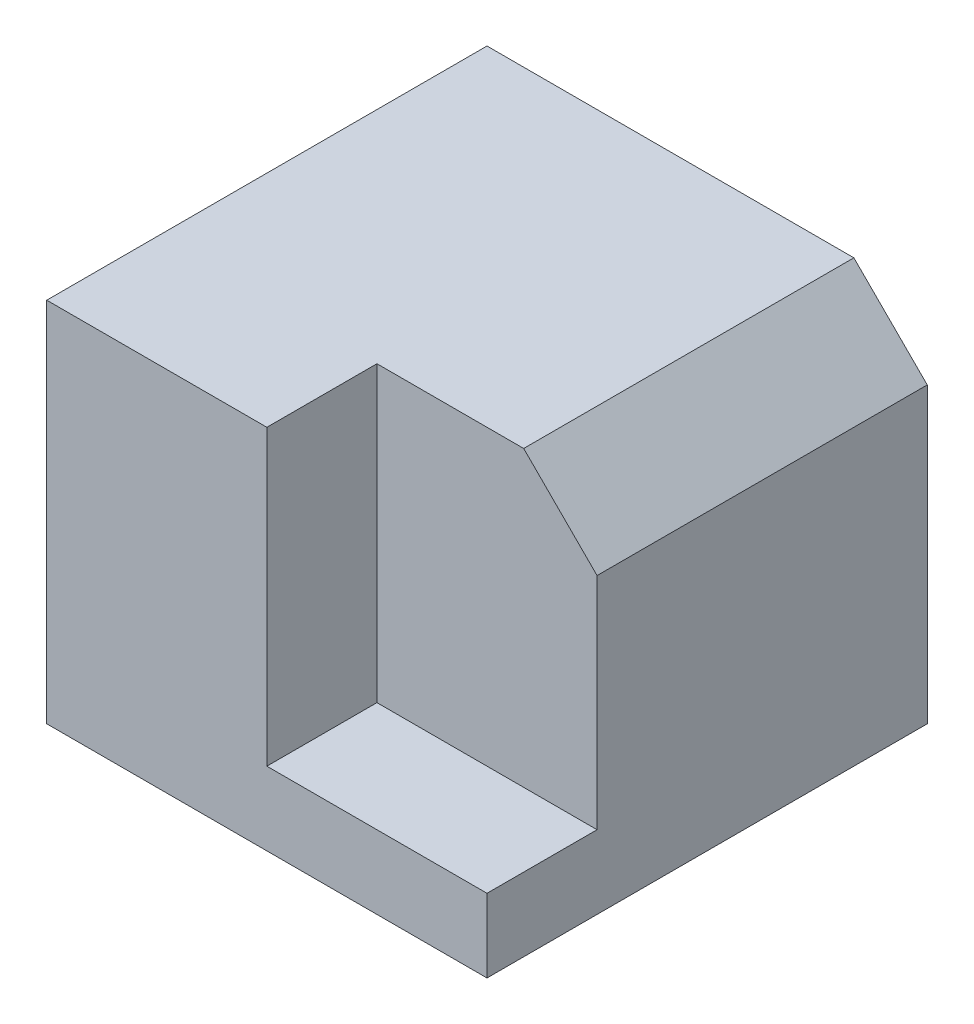
ISO-10303-21;
HEADER;
FILE_DESCRIPTION(('STEP AP214'),'2;1');
FILE_NAME('part.step','',(''),(''),'','','');
FILE_SCHEMA(('AUTOMOTIVE_DESIGN { 1 0 10303 214 1 1 1 1 }'));
ENDSEC;
DATA;
#1=APPLICATION_CONTEXT('core data for automotive mechanical design processes');
#2=APPLICATION_PROTOCOL_DEFINITION('international standard','automotive_design',2000,#1);
#3=PRODUCT_CONTEXT('',#1,'mechanical');
#4=PRODUCT('Part','Part','',(#3));
#5=PRODUCT_RELATED_PRODUCT_CATEGORY('part','',(#4));
#6=PRODUCT_DEFINITION_FORMATION('','',#4);
#7=PRODUCT_DEFINITION_CONTEXT('part definition',#1,'design');
#8=PRODUCT_DEFINITION('design','',#6,#7);
#9=PRODUCT_DEFINITION_SHAPE('','',#8);
#10=(LENGTH_UNIT() NAMED_UNIT(*) SI_UNIT(.MILLI.,.METRE.));
#11=(NAMED_UNIT(*) PLANE_ANGLE_UNIT() SI_UNIT($,.RADIAN.));
#12=(NAMED_UNIT(*) SI_UNIT($,.STERADIAN.) SOLID_ANGLE_UNIT());
#13=UNCERTAINTY_MEASURE_WITH_UNIT(LENGTH_MEASURE(1.E-05),#10,'distance_accuracy_value','');
#14=(GEOMETRIC_REPRESENTATION_CONTEXT(3) GLOBAL_UNCERTAINTY_ASSIGNED_CONTEXT((#13)) GLOBAL_UNIT_ASSIGNED_CONTEXT((#10,
#11,#12)) REPRESENTATION_CONTEXT('',''));
#15=CARTESIAN_POINT('',(0.,0.,0.));
#16=DIRECTION('',(0.,0.,1.));
#17=DIRECTION('',(1.,0.,0.));
#18=AXIS2_PLACEMENT_3D('',#15,#16,#17);
#19=CARTESIAN_POINT('',(-30.,50.,-30.));
#20=DIRECTION('',(1.,0.,0.));
#21=DIRECTION('',(0.,0.,-1.));
#22=AXIS2_PLACEMENT_3D('',#19,#20,#21);
#23=PLANE('',#22);
#24=DIRECTION('',(0.,0.,1.));
#25=VECTOR('',#24,1.);
#26=CARTESIAN_POINT('',(-30.,0.,-30.));
#27=LINE('',#26,#25);
#28=CARTESIAN_POINT('',(-30.,0.,-30.));
#29=VERTEX_POINT('',#28);
#30=CARTESIAN_POINT('',(-30.,0.,30.));
#31=VERTEX_POINT('',#30);
#32=EDGE_CURVE('E133',#29,#31,#27,.T.);
#33=ORIENTED_EDGE('',*,*,#32,.T.);
#34=DIRECTION('',(0.,-1.,0.));
#35=VECTOR('',#34,1.);
#36=CARTESIAN_POINT('',(-30.,50.,30.));
#37=LINE('',#36,#35);
#38=CARTESIAN_POINT('',(-30.,50.,30.));
#39=VERTEX_POINT('',#38);
#40=EDGE_CURVE('E149',#39,#31,#37,.T.);
#41=ORIENTED_EDGE('',*,*,#40,.F.);
#42=DIRECTION('',(0.,0.,1.));
#43=VECTOR('',#42,1.);
#44=CARTESIAN_POINT('',(-30.,50.,-30.));
#45=LINE('',#44,#43);
#46=CARTESIAN_POINT('',(-30.,50.,-30.));
#47=VERTEX_POINT('',#46);
#48=EDGE_CURVE('E123',#47,#39,#45,.T.);
#49=ORIENTED_EDGE('',*,*,#48,.F.);
#50=DIRECTION('',(0.,-1.,0.));
#51=VECTOR('',#50,1.);
#52=CARTESIAN_POINT('',(-30.,50.,-30.));
#53=LINE('',#52,#51);
#54=EDGE_CURVE('E132',#47,#29,#53,.T.);
#55=ORIENTED_EDGE('',*,*,#54,.T.);
#56=EDGE_LOOP('',(#33,#41,#49,#55));
#57=FACE_BOUND('',#56,.T.);
#58=ADVANCED_FACE('F33',(#57),#23,.F.);
#59=CARTESIAN_POINT('',(30.,50.,30.));
#60=DIRECTION('',(0.,0.,-1.));
#61=DIRECTION('',(-1.,0.,0.));
#62=AXIS2_PLACEMENT_3D('',#59,#60,#61);
#63=PLANE('',#62);
#64=DIRECTION('',(1.,0.,0.));
#65=VECTOR('',#64,1.);
#66=CARTESIAN_POINT('',(30.,10.,30.));
#67=LINE('',#66,#65);
#68=CARTESIAN_POINT('',(0.,10.,30.));
#69=VERTEX_POINT('',#68);
#70=CARTESIAN_POINT('',(30.,10.,30.));
#71=VERTEX_POINT('',#70);
#72=EDGE_CURVE('E112',#69,#71,#67,.T.);
#73=ORIENTED_EDGE('',*,*,#72,.F.);
#74=DIRECTION('',(0.,1.,0.));
#75=VECTOR('',#74,1.);
#76=CARTESIAN_POINT('',(0.,10.,30.));
#77=LINE('',#76,#75);
#78=CARTESIAN_POINT('',(0.,50.,30.));
#79=VERTEX_POINT('',#78);
#80=EDGE_CURVE('E118',#69,#79,#77,.T.);
#81=ORIENTED_EDGE('',*,*,#80,.T.);
#82=DIRECTION('',(1.,0.,0.));
#83=VECTOR('',#82,1.);
#84=CARTESIAN_POINT('',(30.,50.,30.));
#85=LINE('',#84,#83);
#86=EDGE_CURVE('E126',#39,#79,#85,.T.);
#87=ORIENTED_EDGE('',*,*,#86,.F.);
#88=ORIENTED_EDGE('',*,*,#40,.T.);
#89=DIRECTION('',(1.,0.,0.));
#90=VECTOR('',#89,1.);
#91=CARTESIAN_POINT('',(30.,0.,30.));
#92=LINE('',#91,#90);
#93=CARTESIAN_POINT('',(30.,0.,30.));
#94=VERTEX_POINT('',#93);
#95=EDGE_CURVE('E136',#31,#94,#92,.T.);
#96=ORIENTED_EDGE('',*,*,#95,.T.);
#97=DIRECTION('',(0.,-1.,0.));
#98=VECTOR('',#97,1.);
#99=CARTESIAN_POINT('',(30.,50.,30.));
#100=LINE('',#99,#98);
#101=EDGE_CURVE('E147',#71,#94,#100,.T.);
#102=ORIENTED_EDGE('',*,*,#101,.F.);
#103=EDGE_LOOP('',(#73,#81,#87,#88,#96,#102));
#104=FACE_BOUND('',#103,.T.);
#105=ADVANCED_FACE('F171',(#104),#63,.F.);
#106=CARTESIAN_POINT('',(30.,50.,-30.));
#107=DIRECTION('',(-1.,0.,0.));
#108=DIRECTION('',(0.,0.,1.));
#109=AXIS2_PLACEMENT_3D('',#106,#107,#108);
#110=PLANE('',#109);
#111=DIRECTION('',(0.,-1.,0.));
#112=VECTOR('',#111,1.);
#113=CARTESIAN_POINT('',(30.,50.,-30.));
#114=LINE('',#113,#112);
#115=CARTESIAN_POINT('',(30.,40.,-30.));
#116=VERTEX_POINT('',#115);
#117=CARTESIAN_POINT('',(30.,0.,-30.));
#118=VERTEX_POINT('',#117);
#119=EDGE_CURVE('E145',#116,#118,#114,.T.);
#120=ORIENTED_EDGE('',*,*,#119,.F.);
#121=DIRECTION('',(0.,0.,1.));
#122=VECTOR('',#121,1.);
#123=CARTESIAN_POINT('',(30.,40.,-30.));
#124=LINE('',#123,#122);
#125=CARTESIAN_POINT('',(30.,40.,15.));
#126=VERTEX_POINT('',#125);
#127=EDGE_CURVE('E41',#116,#126,#124,.T.);
#128=ORIENTED_EDGE('',*,*,#127,.T.);
#129=DIRECTION('',(0.,1.,0.));
#130=VECTOR('',#129,1.);
#131=CARTESIAN_POINT('',(30.,10.,15.));
#132=LINE('',#131,#130);
#133=CARTESIAN_POINT('',(30.,10.,15.));
#134=VERTEX_POINT('',#133);
#135=EDGE_CURVE('E99',#134,#126,#132,.T.);
#136=ORIENTED_EDGE('',*,*,#135,.F.);
#137=DIRECTION('',(0.,0.,-1.));
#138=VECTOR('',#137,1.);
#139=CARTESIAN_POINT('',(30.,10.,15.));
#140=LINE('',#139,#138);
#141=EDGE_CURVE('E107',#71,#134,#140,.T.);
#142=ORIENTED_EDGE('',*,*,#141,.F.);
#143=ORIENTED_EDGE('',*,*,#101,.T.);
#144=DIRECTION('',(0.,0.,-1.));
#145=VECTOR('',#144,1.);
#146=CARTESIAN_POINT('',(30.,0.,-30.));
#147=LINE('',#146,#145);
#148=EDGE_CURVE('E139',#94,#118,#147,.T.);
#149=ORIENTED_EDGE('',*,*,#148,.T.);
#150=EDGE_LOOP('',(#120,#128,#136,#142,#143,#149));
#151=FACE_BOUND('',#150,.T.);
#152=ADVANCED_FACE('F116',(#151),#110,.F.);
#153=CARTESIAN_POINT('',(30.,50.,-30.));
#154=DIRECTION('',(0.,0.,1.));
#155=DIRECTION('',(1.,0.,0.));
#156=AXIS2_PLACEMENT_3D('',#153,#154,#155);
#157=PLANE('',#156);
#158=DIRECTION('',(-1.,0.,0.));
#159=VECTOR('',#158,1.);
#160=CARTESIAN_POINT('',(30.,50.,-30.));
#161=LINE('',#160,#159);
#162=CARTESIAN_POINT('',(20.,50.,-30.));
#163=VERTEX_POINT('',#162);
#164=EDGE_CURVE('E130',#163,#47,#161,.T.);
#165=ORIENTED_EDGE('',*,*,#164,.F.);
#166=DIRECTION('',(-0.707106781186546,0.707106781186549,0.));
#167=VECTOR('',#166,1.);
#168=CARTESIAN_POINT('',(20.,50.,-30.));
#169=LINE('',#168,#167);
#170=EDGE_CURVE('E55',#163,#116,#169,.F.);
#171=ORIENTED_EDGE('',*,*,#170,.T.);
#172=ORIENTED_EDGE('',*,*,#119,.T.);
#173=DIRECTION('',(-1.,0.,0.));
#174=VECTOR('',#173,1.);
#175=CARTESIAN_POINT('',(30.,0.,-30.));
#176=LINE('',#175,#174);
#177=EDGE_CURVE('E127',#118,#29,#176,.T.);
#178=ORIENTED_EDGE('',*,*,#177,.T.);
#179=ORIENTED_EDGE('',*,*,#54,.F.);
#180=EDGE_LOOP('',(#165,#171,#172,#178,#179));
#181=FACE_BOUND('',#180,.T.);
#182=ADVANCED_FACE('F163',(#181),#157,.F.);
#183=CARTESIAN_POINT('',(0.,50.,0.));
#184=DIRECTION('',(0.,-1.,0.));
#185=DIRECTION('',(0.,0.,-1.));
#186=AXIS2_PLACEMENT_3D('',#183,#184,#185);
#187=PLANE('',#186);
#188=DIRECTION('',(-1.,0.,0.));
#189=VECTOR('',#188,1.);
#190=CARTESIAN_POINT('',(30.,50.,15.));
#191=LINE('',#190,#189);
#192=CARTESIAN_POINT('',(20.,50.,15.));
#193=VERTEX_POINT('',#192);
#194=CARTESIAN_POINT('',(0.,50.,15.));
#195=VERTEX_POINT('',#194);
#196=EDGE_CURVE('E161',#193,#195,#191,.T.);
#197=ORIENTED_EDGE('',*,*,#196,.F.);
#198=DIRECTION('',(0.,0.,-1.));
#199=VECTOR('',#198,1.);
#200=CARTESIAN_POINT('',(20.,50.,0.));
#201=LINE('',#200,#199);
#202=EDGE_CURVE('E152',#193,#163,#201,.T.);
#203=ORIENTED_EDGE('',*,*,#202,.T.);
#204=ORIENTED_EDGE('',*,*,#164,.T.);
#205=ORIENTED_EDGE('',*,*,#48,.T.);
#206=ORIENTED_EDGE('',*,*,#86,.T.);
#207=DIRECTION('',(0.,0.,1.));
#208=VECTOR('',#207,1.);
#209=CARTESIAN_POINT('',(0.,50.,15.));
#210=LINE('',#209,#208);
#211=EDGE_CURVE('E114',#195,#79,#210,.T.);
#212=ORIENTED_EDGE('',*,*,#211,.F.);
#213=EDGE_LOOP('',(#197,#203,#204,#205,#206,#212));
#214=FACE_BOUND('',#213,.T.);
#215=ADVANCED_FACE('F158',(#214),#187,.F.);
#216=CARTESIAN_POINT('',(0.,0.,0.));
#217=DIRECTION('',(0.,-1.,0.));
#218=DIRECTION('',(0.,0.,-1.));
#219=AXIS2_PLACEMENT_3D('',#216,#217,#218);
#220=PLANE('',#219);
#221=ORIENTED_EDGE('',*,*,#32,.F.);
#222=ORIENTED_EDGE('',*,*,#177,.F.);
#223=ORIENTED_EDGE('',*,*,#148,.F.);
#224=ORIENTED_EDGE('',*,*,#95,.F.);
#225=EDGE_LOOP('',(#221,#222,#223,#224));
#226=FACE_BOUND('',#225,.T.);
#227=ADVANCED_FACE('F178',(#226),#220,.T.);
#228=CARTESIAN_POINT('',(0.,10.,15.));
#229=DIRECTION('',(-1.,0.,0.));
#230=DIRECTION('',(0.,0.,1.));
#231=AXIS2_PLACEMENT_3D('',#228,#229,#230);
#232=PLANE('',#231);
#233=ORIENTED_EDGE('',*,*,#211,.T.);
#234=ORIENTED_EDGE('',*,*,#80,.F.);
#235=DIRECTION('',(0.,0.,1.));
#236=VECTOR('',#235,1.);
#237=CARTESIAN_POINT('',(0.,10.,15.));
#238=LINE('',#237,#236);
#239=CARTESIAN_POINT('',(0.,10.,15.));
#240=VERTEX_POINT('',#239);
#241=EDGE_CURVE('E106',#240,#69,#238,.T.);
#242=ORIENTED_EDGE('',*,*,#241,.F.);
#243=DIRECTION('',(0.,1.,0.));
#244=VECTOR('',#243,1.);
#245=CARTESIAN_POINT('',(0.,10.,15.));
#246=LINE('',#245,#244);
#247=EDGE_CURVE('E102',#240,#195,#246,.T.);
#248=ORIENTED_EDGE('',*,*,#247,.T.);
#249=EDGE_LOOP('',(#233,#234,#242,#248));
#250=FACE_BOUND('',#249,.T.);
#251=ADVANCED_FACE('F176',(#250),#232,.F.);
#252=CARTESIAN_POINT('',(30.,10.,15.));
#253=DIRECTION('',(0.,0.,-1.));
#254=DIRECTION('',(-1.,0.,0.));
#255=AXIS2_PLACEMENT_3D('',#252,#253,#254);
#256=PLANE('',#255);
#257=ORIENTED_EDGE('',*,*,#135,.T.);
#258=DIRECTION('',(0.707106781186546,-0.707106781186549,0.));
#259=VECTOR('',#258,1.);
#260=CARTESIAN_POINT('',(20.,50.,15.));
#261=LINE('',#260,#259);
#262=EDGE_CURVE('E11',#126,#193,#261,.F.);
#263=ORIENTED_EDGE('',*,*,#262,.T.);
#264=ORIENTED_EDGE('',*,*,#196,.T.);
#265=ORIENTED_EDGE('',*,*,#247,.F.);
#266=DIRECTION('',(-1.,0.,0.));
#267=VECTOR('',#266,1.);
#268=CARTESIAN_POINT('',(30.,10.,15.));
#269=LINE('',#268,#267);
#270=EDGE_CURVE('E96',#134,#240,#269,.T.);
#271=ORIENTED_EDGE('',*,*,#270,.F.);
#272=EDGE_LOOP('',(#257,#263,#264,#265,#271));
#273=FACE_BOUND('',#272,.T.);
#274=ADVANCED_FACE('F98',(#273),#256,.F.);
#275=CARTESIAN_POINT('',(0.,10.,0.));
#276=DIRECTION('',(0.,-1.,0.));
#277=DIRECTION('',(0.,0.,-1.));
#278=AXIS2_PLACEMENT_3D('',#275,#276,#277);
#279=PLANE('',#278);
#280=ORIENTED_EDGE('',*,*,#141,.T.);
#281=ORIENTED_EDGE('',*,*,#270,.T.);
#282=ORIENTED_EDGE('',*,*,#241,.T.);
#283=ORIENTED_EDGE('',*,*,#72,.T.);
#284=EDGE_LOOP('',(#280,#281,#282,#283));
#285=FACE_BOUND('',#284,.T.);
#286=ADVANCED_FACE('F110',(#285),#279,.F.);
#287=CARTESIAN_POINT('',(20.,50.,0.));
#288=DIRECTION('',(-0.707106781186549,-0.707106781186546,0.));
#289=DIRECTION('',(0.,0.,-1.));
#290=AXIS2_PLACEMENT_3D('',#287,#288,#289);
#291=PLANE('',#290);
#292=ORIENTED_EDGE('',*,*,#262,.F.);
#293=ORIENTED_EDGE('',*,*,#127,.F.);
#294=ORIENTED_EDGE('',*,*,#170,.F.);
#295=ORIENTED_EDGE('',*,*,#202,.F.);
#296=EDGE_LOOP('',(#292,#293,#294,#295));
#297=FACE_BOUND('',#296,.T.);
#298=ADVANCED_FACE('F35',(#297),#291,.F.);
#299=CLOSED_SHELL('',(#58,#105,#152,#182,#215,#227,#251,#274,#286,#298));
#300=MANIFOLD_SOLID_BREP('B2',#299);
#301=ADVANCED_BREP_SHAPE_REPRESENTATION('',(#18,#300),#14);
#302=SHAPE_DEFINITION_REPRESENTATION(#9,#301);
ENDSEC;
END-ISO-10303-21;
